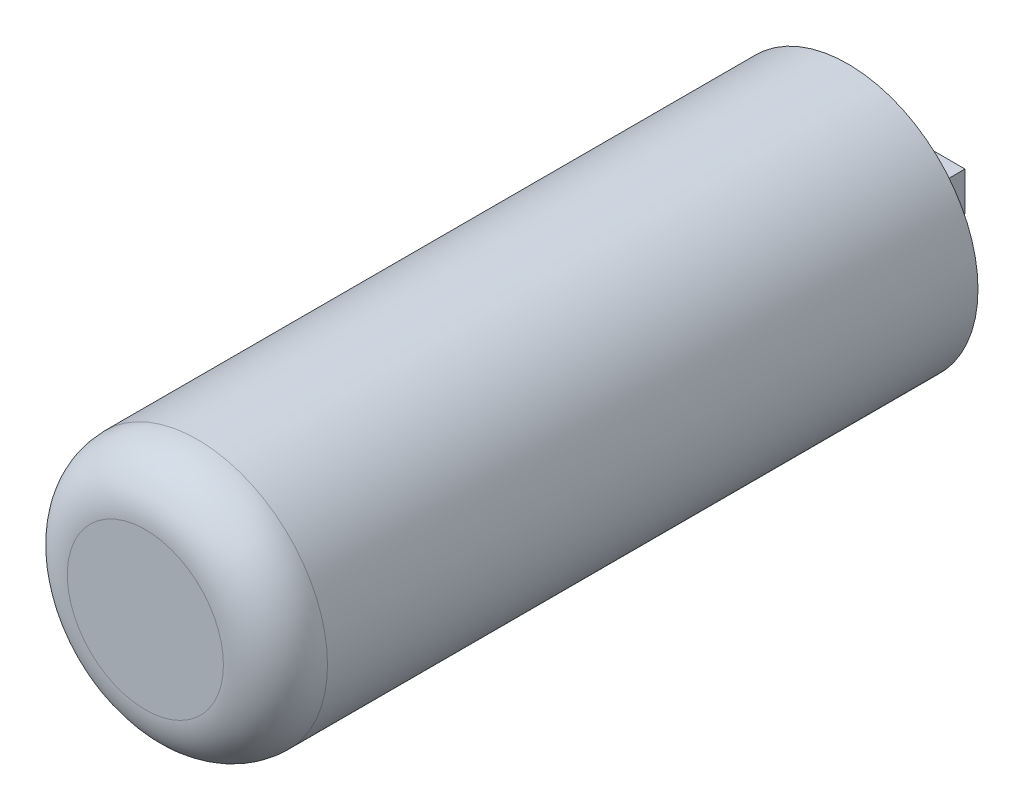
ISO-10303-21;
HEADER;
FILE_DESCRIPTION(('STEP AP214'),'2;1');
FILE_NAME('part.step','',(''),(''),'','','');
FILE_SCHEMA(('AUTOMOTIVE_DESIGN { 1 0 10303 214 1 1 1 1 }'));
ENDSEC;
DATA;
#1=APPLICATION_CONTEXT('core data for automotive mechanical design processes');
#2=APPLICATION_PROTOCOL_DEFINITION('international standard','automotive_design',2000,#1);
#3=PRODUCT_CONTEXT('',#1,'mechanical');
#4=PRODUCT('Part','Part','',(#3));
#5=PRODUCT_RELATED_PRODUCT_CATEGORY('part','',(#4));
#6=PRODUCT_DEFINITION_FORMATION('','',#4);
#7=PRODUCT_DEFINITION_CONTEXT('part definition',#1,'design');
#8=PRODUCT_DEFINITION('design','',#6,#7);
#9=PRODUCT_DEFINITION_SHAPE('','',#8);
#10=(LENGTH_UNIT() NAMED_UNIT(*) SI_UNIT(.MILLI.,.METRE.));
#11=(NAMED_UNIT(*) PLANE_ANGLE_UNIT() SI_UNIT($,.RADIAN.));
#12=(NAMED_UNIT(*) SI_UNIT($,.STERADIAN.) SOLID_ANGLE_UNIT());
#13=UNCERTAINTY_MEASURE_WITH_UNIT(LENGTH_MEASURE(1.E-05),#10,'distance_accuracy_value','');
#14=(GEOMETRIC_REPRESENTATION_CONTEXT(3) GLOBAL_UNCERTAINTY_ASSIGNED_CONTEXT((#13)) GLOBAL_UNIT_ASSIGNED_CONTEXT((#10,
#11,#12)) REPRESENTATION_CONTEXT('',''));
#15=CARTESIAN_POINT('',(0.,0.,0.));
#16=DIRECTION('',(0.,0.,1.));
#17=DIRECTION('',(1.,0.,0.));
#18=AXIS2_PLACEMENT_3D('',#15,#16,#17);
#19=CARTESIAN_POINT('',(0.,0.,0.));
#20=DIRECTION('',(0.,0.,1.));
#21=DIRECTION('',(1.,0.,0.));
#22=AXIS2_PLACEMENT_3D('',#19,#20,#21);
#23=PLANE('',#22);
#24=CARTESIAN_POINT('',(0.,0.,0.));
#25=DIRECTION('',(0.,0.,1.));
#26=DIRECTION('',(1.,0.,0.));
#27=AXIS2_PLACEMENT_3D('',#24,#25,#26);
#28=CIRCLE('',#27,5.);
#29=CARTESIAN_POINT('',(5.,0.,0.));
#30=VERTEX_POINT('',#29);
#31=EDGE_CURVE('E95',#30,#30,#28,.T.);
#32=ORIENTED_EDGE('',*,*,#31,.F.);
#33=EDGE_LOOP('',(#32));
#34=FACE_BOUND('',#33,.T.);
#35=DIRECTION('',(0.,1.,0.));
#36=VECTOR('',#35,1.);
#37=CARTESIAN_POINT('',(-1.5,0.75,0.));
#38=LINE('',#37,#36);
#39=CARTESIAN_POINT('',(-1.5,-0.75,0.));
#40=VERTEX_POINT('',#39);
#41=CARTESIAN_POINT('',(-1.5,0.75,0.));
#42=VERTEX_POINT('',#41);
#43=EDGE_CURVE('E49',#40,#42,#38,.T.);
#44=ORIENTED_EDGE('',*,*,#43,.F.);
#45=DIRECTION('',(-1.,0.,0.));
#46=VECTOR('',#45,1.);
#47=CARTESIAN_POINT('',(1.5,-0.75,0.));
#48=LINE('',#47,#46);
#49=CARTESIAN_POINT('',(1.5,-0.75,0.));
#50=VERTEX_POINT('',#49);
#51=EDGE_CURVE('E53',#50,#40,#48,.T.);
#52=ORIENTED_EDGE('',*,*,#51,.F.);
#53=DIRECTION('',(0.,-1.,0.));
#54=VECTOR('',#53,1.);
#55=CARTESIAN_POINT('',(1.5,0.75,0.));
#56=LINE('',#55,#54);
#57=CARTESIAN_POINT('',(1.5,0.75,0.));
#58=VERTEX_POINT('',#57);
#59=EDGE_CURVE('E159',#58,#50,#56,.T.);
#60=ORIENTED_EDGE('',*,*,#59,.F.);
#61=DIRECTION('',(1.,0.,0.));
#62=VECTOR('',#61,1.);
#63=CARTESIAN_POINT('',(1.5,0.75,0.));
#64=LINE('',#63,#62);
#65=EDGE_CURVE('E151',#42,#58,#64,.T.);
#66=ORIENTED_EDGE('',*,*,#65,.F.);
#67=EDGE_LOOP('',(#44,#52,#60,#66));
#68=FACE_BOUND('',#67,.T.);
#69=ADVANCED_FACE('F33',(#34,#68),#23,.F.);
#70=CARTESIAN_POINT('',(0.,0.,27.));
#71=DIRECTION('',(0.,0.,-1.));
#72=DIRECTION('',(-1.,0.,0.));
#73=AXIS2_PLACEMENT_3D('',#70,#71,#72);
#74=CYLINDRICAL_SURFACE('',#73,5.);
#75=CARTESIAN_POINT('',(0.,0.,25.));
#76=DIRECTION('',(0.,0.,1.));
#77=DIRECTION('',(1.,0.,0.));
#78=AXIS2_PLACEMENT_3D('',#75,#76,#77);
#79=CIRCLE('',#78,5.);
#80=CARTESIAN_POINT('',(5.,0.,25.));
#81=VERTEX_POINT('',#80);
#82=EDGE_CURVE('E11',#81,#81,#79,.F.);
#83=ORIENTED_EDGE('',*,*,#82,.T.);
#84=EDGE_LOOP('',(#83));
#85=FACE_BOUND('',#84,.T.);
#86=ORIENTED_EDGE('',*,*,#31,.T.);
#87=EDGE_LOOP('',(#86));
#88=FACE_BOUND('',#87,.T.);
#89=ADVANCED_FACE('F115',(#85,#88),#74,.T.);
#90=CARTESIAN_POINT('',(0.,0.,27.));
#91=DIRECTION('',(0.,0.,1.));
#92=DIRECTION('',(1.,0.,0.));
#93=AXIS2_PLACEMENT_3D('',#90,#91,#92);
#94=PLANE('',#93);
#95=CARTESIAN_POINT('',(0.,0.,27.));
#96=DIRECTION('',(0.,0.,1.));
#97=DIRECTION('',(1.,0.,0.));
#98=AXIS2_PLACEMENT_3D('',#95,#96,#97);
#99=CIRCLE('',#98,3.);
#100=CARTESIAN_POINT('',(3.,0.,27.));
#101=VERTEX_POINT('',#100);
#102=EDGE_CURVE('E42',#101,#101,#99,.T.);
#103=ORIENTED_EDGE('',*,*,#102,.T.);
#104=EDGE_LOOP('',(#103));
#105=FACE_BOUND('',#104,.T.);
#106=ADVANCED_FACE('F106',(#105),#94,.T.);
#107=CARTESIAN_POINT('',(0.,0.,25.));
#108=DIRECTION('',(0.,0.,1.));
#109=DIRECTION('',(1.,0.,0.));
#110=AXIS2_PLACEMENT_3D('',#107,#108,#109);
#111=TOROIDAL_SURFACE('',#110,3.,2.);
#112=ORIENTED_EDGE('',*,*,#82,.F.);
#113=EDGE_LOOP('',(#112));
#114=FACE_BOUND('',#113,.T.);
#115=ORIENTED_EDGE('',*,*,#102,.F.);
#116=EDGE_LOOP('',(#115));
#117=FACE_BOUND('',#116,.T.);
#118=ADVANCED_FACE('F35',(#114,#117),#111,.T.);
#119=CARTESIAN_POINT('',(-1.5,0.75,-3.));
#120=DIRECTION('',(1.,0.,0.));
#121=DIRECTION('',(0.,0.,-1.));
#122=AXIS2_PLACEMENT_3D('',#119,#120,#121);
#123=PLANE('',#122);
#124=ORIENTED_EDGE('',*,*,#43,.T.);
#125=DIRECTION('',(0.,0.,1.));
#126=VECTOR('',#125,1.);
#127=CARTESIAN_POINT('',(-1.5,0.75,-3.));
#128=LINE('',#127,#126);
#129=CARTESIAN_POINT('',(-1.5,0.75,-3.));
#130=VERTEX_POINT('',#129);
#131=EDGE_CURVE('E78',#130,#42,#128,.T.);
#132=ORIENTED_EDGE('',*,*,#131,.F.);
#133=DIRECTION('',(0.,1.,0.));
#134=VECTOR('',#133,1.);
#135=CARTESIAN_POINT('',(-1.5,0.75,-3.));
#136=LINE('',#135,#134);
#137=CARTESIAN_POINT('',(-1.5,-0.75,-3.));
#138=VERTEX_POINT('',#137);
#139=EDGE_CURVE('E84',#138,#130,#136,.T.);
#140=ORIENTED_EDGE('',*,*,#139,.F.);
#141=DIRECTION('',(0.,0.,1.));
#142=VECTOR('',#141,1.);
#143=CARTESIAN_POINT('',(-1.5,-0.75,-3.));
#144=LINE('',#143,#142);
#145=EDGE_CURVE('E156',#138,#40,#144,.T.);
#146=ORIENTED_EDGE('',*,*,#145,.T.);
#147=EDGE_LOOP('',(#124,#132,#140,#146));
#148=FACE_BOUND('',#147,.T.);
#149=ADVANCED_FACE('F94',(#148),#123,.F.);
#150=CARTESIAN_POINT('',(1.5,0.75,-3.));
#151=DIRECTION('',(0.,-1.,0.));
#152=DIRECTION('',(0.,0.,-1.));
#153=AXIS2_PLACEMENT_3D('',#150,#151,#152);
#154=PLANE('',#153);
#155=CARTESIAN_POINT('',(0.,0.75,-1.5));
#156=DIRECTION('',(0.,1.,0.));
#157=DIRECTION('',(0.,0.,1.));
#158=AXIS2_PLACEMENT_3D('',#155,#156,#157);
#159=CIRCLE('',#158,0.75);
#160=CARTESIAN_POINT('',(0.,0.75,-0.75));
#161=VERTEX_POINT('',#160);
#162=EDGE_CURVE('E148',#161,#161,#159,.T.);
#163=ORIENTED_EDGE('',*,*,#162,.F.);
#164=EDGE_LOOP('',(#163));
#165=FACE_BOUND('',#164,.T.);
#166=ORIENTED_EDGE('',*,*,#65,.T.);
#167=DIRECTION('',(0.,0.,1.));
#168=VECTOR('',#167,1.);
#169=CARTESIAN_POINT('',(1.5,0.75,-3.));
#170=LINE('',#169,#168);
#171=CARTESIAN_POINT('',(1.5,0.75,-3.));
#172=VERTEX_POINT('',#171);
#173=EDGE_CURVE('E80',#172,#58,#170,.T.);
#174=ORIENTED_EDGE('',*,*,#173,.F.);
#175=DIRECTION('',(1.,0.,0.));
#176=VECTOR('',#175,1.);
#177=CARTESIAN_POINT('',(1.5,0.75,-3.));
#178=LINE('',#177,#176);
#179=EDGE_CURVE('E73',#130,#172,#178,.T.);
#180=ORIENTED_EDGE('',*,*,#179,.F.);
#181=ORIENTED_EDGE('',*,*,#131,.T.);
#182=EDGE_LOOP('',(#166,#174,#180,#181));
#183=FACE_BOUND('',#182,.T.);
#184=ADVANCED_FACE('F76',(#165,#183),#154,.F.);
#185=CARTESIAN_POINT('',(1.5,0.75,-3.));
#186=DIRECTION('',(-1.,0.,0.));
#187=DIRECTION('',(0.,0.,1.));
#188=AXIS2_PLACEMENT_3D('',#185,#186,#187);
#189=PLANE('',#188);
#190=ORIENTED_EDGE('',*,*,#59,.T.);
#191=DIRECTION('',(0.,0.,1.));
#192=VECTOR('',#191,1.);
#193=CARTESIAN_POINT('',(1.5,-0.75,-3.));
#194=LINE('',#193,#192);
#195=CARTESIAN_POINT('',(1.5,-0.75,-3.));
#196=VERTEX_POINT('',#195);
#197=EDGE_CURVE('E99',#196,#50,#194,.T.);
#198=ORIENTED_EDGE('',*,*,#197,.F.);
#199=DIRECTION('',(0.,-1.,0.));
#200=VECTOR('',#199,1.);
#201=CARTESIAN_POINT('',(1.5,0.75,-3.));
#202=LINE('',#201,#200);
#203=EDGE_CURVE('E83',#172,#196,#202,.T.);
#204=ORIENTED_EDGE('',*,*,#203,.F.);
#205=ORIENTED_EDGE('',*,*,#173,.T.);
#206=EDGE_LOOP('',(#190,#198,#204,#205));
#207=FACE_BOUND('',#206,.T.);
#208=ADVANCED_FACE('F129',(#207),#189,.F.);
#209=CARTESIAN_POINT('',(1.5,-0.75,-3.));
#210=DIRECTION('',(0.,1.,0.));
#211=DIRECTION('',(0.,0.,1.));
#212=AXIS2_PLACEMENT_3D('',#209,#210,#211);
#213=PLANE('',#212);
#214=CARTESIAN_POINT('',(0.,-0.75,-1.5));
#215=DIRECTION('',(0.,1.,0.));
#216=DIRECTION('',(0.,0.,1.));
#217=AXIS2_PLACEMENT_3D('',#214,#215,#216);
#218=CIRCLE('',#217,0.75);
#219=CARTESIAN_POINT('',(0.,-0.75,-0.75));
#220=VERTEX_POINT('',#219);
#221=EDGE_CURVE('E37',#220,#220,#218,.T.);
#222=ORIENTED_EDGE('',*,*,#221,.T.);
#223=EDGE_LOOP('',(#222));
#224=FACE_BOUND('',#223,.T.);
#225=ORIENTED_EDGE('',*,*,#51,.T.);
#226=ORIENTED_EDGE('',*,*,#145,.F.);
#227=DIRECTION('',(-1.,0.,0.));
#228=VECTOR('',#227,1.);
#229=CARTESIAN_POINT('',(1.5,-0.75,-3.));
#230=LINE('',#229,#228);
#231=EDGE_CURVE('E89',#196,#138,#230,.T.);
#232=ORIENTED_EDGE('',*,*,#231,.F.);
#233=ORIENTED_EDGE('',*,*,#197,.T.);
#234=EDGE_LOOP('',(#225,#226,#232,#233));
#235=FACE_BOUND('',#234,.T.);
#236=ADVANCED_FACE('F133',(#224,#235),#213,.F.);
#237=CARTESIAN_POINT('',(0.,0.,-3.));
#238=DIRECTION('',(0.,0.,-1.));
#239=DIRECTION('',(-1.,0.,0.));
#240=AXIS2_PLACEMENT_3D('',#237,#238,#239);
#241=PLANE('',#240);
#242=ORIENTED_EDGE('',*,*,#139,.T.);
#243=ORIENTED_EDGE('',*,*,#179,.T.);
#244=ORIENTED_EDGE('',*,*,#203,.T.);
#245=ORIENTED_EDGE('',*,*,#231,.T.);
#246=EDGE_LOOP('',(#242,#243,#244,#245));
#247=FACE_BOUND('',#246,.T.);
#248=ADVANCED_FACE('F87',(#247),#241,.T.);
#249=CARTESIAN_POINT('',(0.,-4.25,-1.5));
#250=DIRECTION('',(0.,1.,0.));
#251=DIRECTION('',(0.,0.,1.));
#252=AXIS2_PLACEMENT_3D('',#249,#250,#251);
#253=CYLINDRICAL_SURFACE('',#252,0.75);
#254=ORIENTED_EDGE('',*,*,#162,.T.);
#255=EDGE_LOOP('',(#254));
#256=FACE_BOUND('',#255,.T.);
#257=ORIENTED_EDGE('',*,*,#221,.F.);
#258=EDGE_LOOP('',(#257));
#259=FACE_BOUND('',#258,.T.);
#260=ADVANCED_FACE('F140',(#256,#259),#253,.F.);
#261=CLOSED_SHELL('',(#69,#89,#106,#118,#149,#184,#208,#236,#248,#260));
#262=MANIFOLD_SOLID_BREP('B2',#261);
#263=ADVANCED_BREP_SHAPE_REPRESENTATION('',(#18,#262),#14);
#264=SHAPE_DEFINITION_REPRESENTATION(#9,#263);
ENDSEC;
END-ISO-10303-21;
